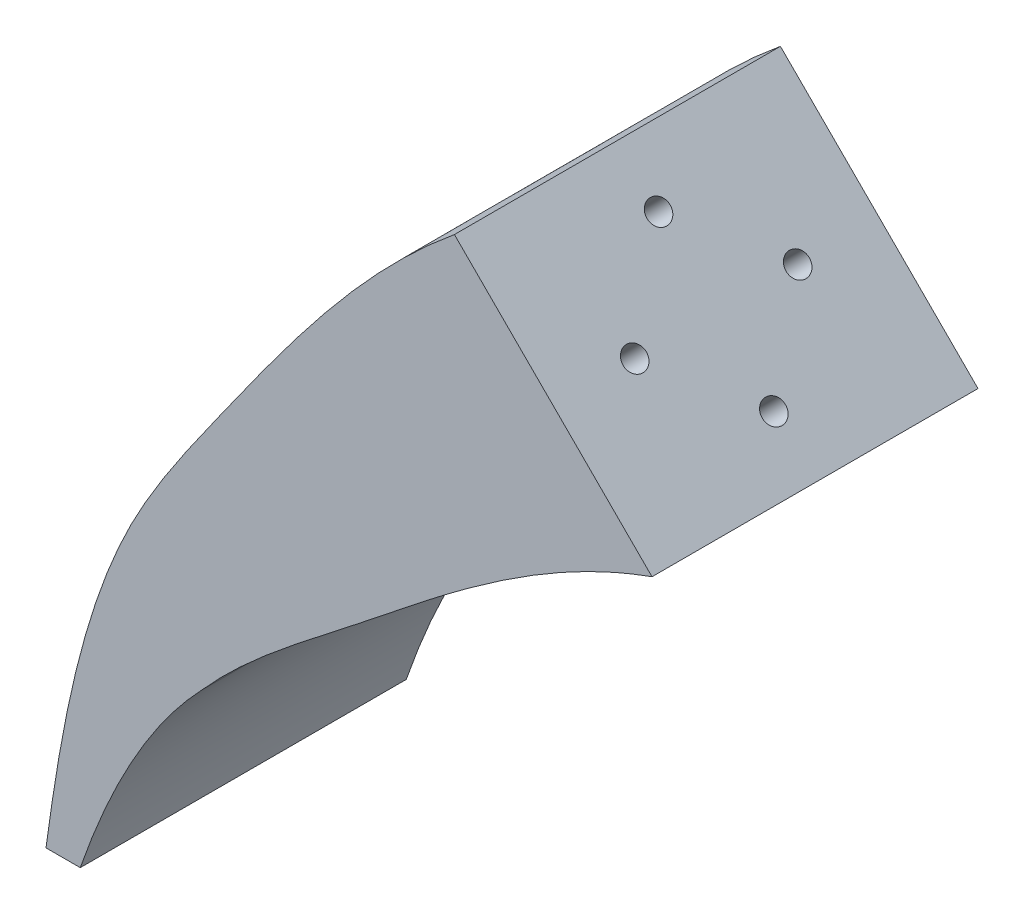
ISO-10303-21;
HEADER;
FILE_DESCRIPTION(('STEP AP214'),'2;1');
FILE_NAME('part.step','',(''),(''),'','','');
FILE_SCHEMA(('AUTOMOTIVE_DESIGN { 1 0 10303 214 1 1 1 1 }'));
ENDSEC;
DATA;
#1=APPLICATION_CONTEXT('core data for automotive mechanical design processes');
#2=APPLICATION_PROTOCOL_DEFINITION('international standard','automotive_design',2000,#1);
#3=PRODUCT_CONTEXT('',#1,'mechanical');
#4=PRODUCT('Part','Part','',(#3));
#5=PRODUCT_RELATED_PRODUCT_CATEGORY('part','',(#4));
#6=PRODUCT_DEFINITION_FORMATION('','',#4);
#7=PRODUCT_DEFINITION_CONTEXT('part definition',#1,'design');
#8=PRODUCT_DEFINITION('design','',#6,#7);
#9=PRODUCT_DEFINITION_SHAPE('','',#8);
#10=(LENGTH_UNIT() NAMED_UNIT(*) SI_UNIT(.MILLI.,.METRE.));
#11=(NAMED_UNIT(*) PLANE_ANGLE_UNIT() SI_UNIT($,.RADIAN.));
#12=(NAMED_UNIT(*) SI_UNIT($,.STERADIAN.) SOLID_ANGLE_UNIT());
#13=UNCERTAINTY_MEASURE_WITH_UNIT(LENGTH_MEASURE(1.E-05),#10,'distance_accuracy_value','');
#14=(GEOMETRIC_REPRESENTATION_CONTEXT(3) GLOBAL_UNCERTAINTY_ASSIGNED_CONTEXT((#13)) GLOBAL_UNIT_ASSIGNED_CONTEXT((#10,
#11,#12)) REPRESENTATION_CONTEXT('',''));
#15=CARTESIAN_POINT('',(0.,0.,0.));
#16=DIRECTION('',(0.,0.,1.));
#17=DIRECTION('',(1.,0.,0.));
#18=AXIS2_PLACEMENT_3D('',#15,#16,#17);
#19=CARTESIAN_POINT('',(2.0914275759303,20.6618620863459,28.));
#20=CARTESIAN_POINT('',(-6.15366528198609,13.9027780772739,28.));
#21=CARTESIAN_POINT('',(-14.8844928634813,1.61368244333864,28.));
#22=CARTESIAN_POINT('',(-29.2039351509306,-18.642558282163,28.));
#23=CARTESIAN_POINT('',(-31.7282489705518,-33.2087317797855,28.));
#24=CARTESIAN_POINT('',(-32.9878737184419,-42.5021430370833,28.));
#25=B_SPLINE_CURVE_WITH_KNOTS('',3,(#19,#20,#21,#22,#23,#24),.UNSPECIFIED.,.F.,.F.,(4,1,1,4),
(0.,0.426775149028711,0.611805153451685,1.),.UNSPECIFIED.);
#26=DIRECTION('',(0.,0.,-1.));
#27=VECTOR('',#26,1.);
#28=SURFACE_OF_LINEAR_EXTRUSION('',#25,#27);
#29=CARTESIAN_POINT('',(2.0914275759303,20.6618620863459,0.));
#30=CARTESIAN_POINT('',(-6.15366528198609,13.9027780772739,0.));
#31=CARTESIAN_POINT('',(-14.8844928634813,1.61368244333864,0.));
#32=CARTESIAN_POINT('',(-29.2039351509306,-18.642558282163,0.));
#33=CARTESIAN_POINT('',(-31.7282489705518,-33.2087317797855,0.));
#34=CARTESIAN_POINT('',(-32.9878737184419,-42.5021430370833,0.));
#35=B_SPLINE_CURVE_WITH_KNOTS('',3,(#29,#30,#31,#32,#33,#34),.UNSPECIFIED.,.F.,.F.,(4,1,1,4),
(0.,0.426775149028711,0.611805153451685,1.),.UNSPECIFIED.);
#36=CARTESIAN_POINT('',(2.0914275759303,20.6618620863459,0.));
#37=VERTEX_POINT('',#36);
#38=CARTESIAN_POINT('',(-32.9878737184419,-42.5021430370833,0.));
#39=VERTEX_POINT('',#38);
#40=EDGE_CURVE('E136',#37,#39,#35,.T.);
#41=ORIENTED_EDGE('',*,*,#40,.T.);
#42=DIRECTION('',(0.,0.,-1.));
#43=VECTOR('',#42,1.);
#44=CARTESIAN_POINT('',(-32.9878737184419,-42.5021430370833,28.));
#45=LINE('',#44,#43);
#46=CARTESIAN_POINT('',(-32.9878737184419,-42.5021430370833,28.));
#47=VERTEX_POINT('',#46);
#48=EDGE_CURVE('E11',#47,#39,#45,.T.);
#49=ORIENTED_EDGE('',*,*,#48,.F.);
#50=CARTESIAN_POINT('',(2.0914275759303,20.6618620863459,28.));
#51=VERTEX_POINT('',#50);
#52=EDGE_CURVE('E153',#51,#47,#25,.T.);
#53=ORIENTED_EDGE('',*,*,#52,.F.);
#54=DIRECTION('',(0.,0.,-1.));
#55=VECTOR('',#54,1.);
#56=CARTESIAN_POINT('',(2.0914275759303,20.6618620863459,28.));
#57=LINE('',#56,#55);
#58=EDGE_CURVE('E105',#51,#37,#57,.T.);
#59=ORIENTED_EDGE('',*,*,#58,.T.);
#60=EDGE_LOOP('',(#41,#49,#53,#59));
#61=FACE_BOUND('',#60,.T.);
#62=ADVANCED_FACE('F34',(#61),#28,.F.);
#63=CARTESIAN_POINT('',(-32.9878737184419,-42.5021430370833,28.));
#64=DIRECTION('',(0.,1.,0.));
#65=DIRECTION('',(0.,0.,1.));
#66=AXIS2_PLACEMENT_3D('',#63,#64,#65);
#67=PLANE('',#66);
#68=DIRECTION('',(1.,0.,0.));
#69=VECTOR('',#68,1.);
#70=CARTESIAN_POINT('',(-32.9878737184419,-42.5021430370833,0.));
#71=LINE('',#70,#69);
#72=CARTESIAN_POINT('',(-30.0455023165282,-42.5021430370833,0.));
#73=VERTEX_POINT('',#72);
#74=EDGE_CURVE('E131',#39,#73,#71,.T.);
#75=ORIENTED_EDGE('',*,*,#74,.T.);
#76=DIRECTION('',(0.,0.,-1.));
#77=VECTOR('',#76,1.);
#78=CARTESIAN_POINT('',(-30.0455023165282,-42.5021430370833,28.));
#79=LINE('',#78,#77);
#80=CARTESIAN_POINT('',(-30.0455023165282,-42.5021430370833,28.));
#81=VERTEX_POINT('',#80);
#82=EDGE_CURVE('E43',#81,#73,#79,.T.);
#83=ORIENTED_EDGE('',*,*,#82,.F.);
#84=DIRECTION('',(1.,0.,0.));
#85=VECTOR('',#84,1.);
#86=CARTESIAN_POINT('',(-32.9878737184419,-42.5021430370833,28.));
#87=LINE('',#86,#85);
#88=EDGE_CURVE('E85',#47,#81,#87,.T.);
#89=ORIENTED_EDGE('',*,*,#88,.F.);
#90=ORIENTED_EDGE('',*,*,#48,.T.);
#91=EDGE_LOOP('',(#75,#83,#89,#90));
#92=FACE_BOUND('',#91,.T.);
#93=ADVANCED_FACE('F125',(#92),#67,.F.);
#94=CARTESIAN_POINT('',(-30.0455023165282,-42.5021430370833,28.));
#95=CARTESIAN_POINT('',(-25.9695620975262,-30.7372945661809,28.));
#96=CARTESIAN_POINT('',(-19.6348790899217,-24.0984832836304,28.));
#97=B_SPLINE_CURVE_WITH_KNOTS('',2,(#94,#95,#96),.UNSPECIFIED.,.F.,.F.,(3,3),(0.,1.),.UNSPECIFIED.);
#98=DIRECTION('',(0.,0.,-1.));
#99=VECTOR('',#98,1.);
#100=SURFACE_OF_LINEAR_EXTRUSION('',#97,#99);
#101=CARTESIAN_POINT('',(-30.0455023165282,-42.5021430370833,0.));
#102=CARTESIAN_POINT('',(-25.9695620975262,-30.7372945661809,0.));
#103=CARTESIAN_POINT('',(-19.6348790899217,-24.0984832836304,0.));
#104=B_SPLINE_CURVE_WITH_KNOTS('',2,(#101,#102,#103),.UNSPECIFIED.,.F.,.F.,(3,3),(0.,1.),.UNSPECIFIED.);
#105=CARTESIAN_POINT('',(-19.6348790899217,-24.0984832836304,0.));
#106=VERTEX_POINT('',#105);
#107=EDGE_CURVE('E100',#73,#106,#104,.T.);
#108=ORIENTED_EDGE('',*,*,#107,.T.);
#109=DIRECTION('',(0.,0.,-1.));
#110=VECTOR('',#109,1.);
#111=CARTESIAN_POINT('',(-19.6348790899217,-24.0984832836304,28.));
#112=LINE('',#111,#110);
#113=CARTESIAN_POINT('',(-19.6348790899217,-24.0984832836304,28.));
#114=VERTEX_POINT('',#113);
#115=EDGE_CURVE('E97',#114,#106,#112,.T.);
#116=ORIENTED_EDGE('',*,*,#115,.F.);
#117=EDGE_CURVE('E89',#81,#114,#97,.T.);
#118=ORIENTED_EDGE('',*,*,#117,.F.);
#119=ORIENTED_EDGE('',*,*,#82,.T.);
#120=EDGE_LOOP('',(#108,#116,#118,#119));
#121=FACE_BOUND('',#120,.T.);
#122=ADVANCED_FACE('F98',(#121),#100,.F.);
#123=CARTESIAN_POINT('',(-19.6348790899217,-24.0984832836304,28.));
#124=CARTESIAN_POINT('',(-15.7102505841867,-19.650895956862,28.));
#125=CARTESIAN_POINT('',(-8.76852159598009,-14.5784334114889,28.));
#126=CARTESIAN_POINT('',(3.60671816571607,-4.50288138401845,28.));
#127=CARTESIAN_POINT('',(12.0226487316539,1.18137436334112,28.));
#128=CARTESIAN_POINT('',(19.0619903244077,3.69129933786898,28.));
#129=B_SPLINE_CURVE_WITH_KNOTS('',3,(#123,#124,#125,#126,#127,#128),.UNSPECIFIED.,.F.,.F.,(4,1,
1,4),(0.,0.368699222009499,0.536895808865272,1.),.UNSPECIFIED.);
#130=DIRECTION('',(0.,0.,-1.));
#131=VECTOR('',#130,1.);
#132=SURFACE_OF_LINEAR_EXTRUSION('',#129,#131);
#133=CARTESIAN_POINT('',(-19.6348790899217,-24.0984832836304,0.));
#134=CARTESIAN_POINT('',(-15.7102505841867,-19.650895956862,0.));
#135=CARTESIAN_POINT('',(-8.76852159598009,-14.5784334114889,0.));
#136=CARTESIAN_POINT('',(3.60671816571607,-4.50288138401845,0.));
#137=CARTESIAN_POINT('',(12.0226487316539,1.18137436334112,0.));
#138=CARTESIAN_POINT('',(19.0619903244077,3.69129933786898,0.));
#139=B_SPLINE_CURVE_WITH_KNOTS('',3,(#133,#134,#135,#136,#137,#138),.UNSPECIFIED.,.F.,.F.,(4,1,
1,4),(0.,0.368699222009499,0.536895808865272,1.),.UNSPECIFIED.);
#140=CARTESIAN_POINT('',(19.0619903244077,3.69129933786898,0.));
#141=VERTEX_POINT('',#140);
#142=EDGE_CURVE('E71',#106,#141,#139,.T.);
#143=ORIENTED_EDGE('',*,*,#142,.T.);
#144=DIRECTION('',(0.,0.,-1.));
#145=VECTOR('',#144,1.);
#146=CARTESIAN_POINT('',(19.0619903244077,3.69129933786898,28.));
#147=LINE('',#146,#145);
#148=CARTESIAN_POINT('',(19.0619903244077,3.69129933786898,28.));
#149=VERTEX_POINT('',#148);
#150=EDGE_CURVE('E101',#149,#141,#147,.T.);
#151=ORIENTED_EDGE('',*,*,#150,.F.);
#152=EDGE_CURVE('E93',#114,#149,#129,.T.);
#153=ORIENTED_EDGE('',*,*,#152,.F.);
#154=ORIENTED_EDGE('',*,*,#115,.T.);
#155=EDGE_LOOP('',(#143,#151,#153,#154));
#156=FACE_BOUND('',#155,.T.);
#157=ADVANCED_FACE('F103',(#156),#132,.F.);
#158=CARTESIAN_POINT('',(2.0914275759303,20.6618620863459,28.));
#159=DIRECTION('',(-0.707106781186539,-0.707106781186556,0.));
#160=DIRECTION('',(0.707106781186556,-0.707106781186539,0.));
#161=AXIS2_PLACEMENT_3D('',#158,#159,#160);
#162=PLANE('',#161);
#163=CARTESIAN_POINT('',(10.576708950169,12.1765807121074,7.));
#164=DIRECTION('',(0.707106781186539,0.707106781186556,0.));
#165=DIRECTION('',(-0.707106781186556,0.707106781186539,0.));
#166=AXIS2_PLACEMENT_3D('',#163,#164,#165);
#167=CIRCLE('',#166,0.999999999999999);
#168=CARTESIAN_POINT('',(9.86960216898242,12.883687493294,7.));
#169=VERTEX_POINT('',#168);
#170=EDGE_CURVE('E157',#169,#169,#167,.T.);
#171=ORIENTED_EDGE('',*,*,#170,.F.);
#172=EDGE_LOOP('',(#171));
#173=FACE_BOUND('',#172,.T.);
#174=CARTESIAN_POINT('',(5.62696148186308,17.1263281804132,14.));
#175=DIRECTION('',(0.707106781186539,0.707106781186556,0.));
#176=DIRECTION('',(0.707106781186556,-0.707106781186539,0.));
#177=AXIS2_PLACEMENT_3D('',#174,#175,#176);
#178=CIRCLE('',#177,1.);
#179=CARTESIAN_POINT('',(6.33406826304964,16.4192213992267,14.));
#180=VERTEX_POINT('',#179);
#181=EDGE_CURVE('E174',#180,#180,#178,.T.);
#182=ORIENTED_EDGE('',*,*,#181,.F.);
#183=EDGE_LOOP('',(#182));
#184=FACE_BOUND('',#183,.T.);
#185=CARTESIAN_POINT('',(15.5264564184749,7.22683324380167,14.));
#186=DIRECTION('',(0.707106781186539,0.707106781186556,0.));
#187=DIRECTION('',(-0.707106781186556,0.707106781186539,0.));
#188=AXIS2_PLACEMENT_3D('',#185,#186,#187);
#189=CIRCLE('',#188,1.);
#190=CARTESIAN_POINT('',(14.8193496372883,7.93394002498821,14.));
#191=VERTEX_POINT('',#190);
#192=EDGE_CURVE('E173',#191,#191,#189,.T.);
#193=ORIENTED_EDGE('',*,*,#192,.F.);
#194=EDGE_LOOP('',(#193));
#195=FACE_BOUND('',#194,.T.);
#196=CARTESIAN_POINT('',(10.576708950169,12.1765807121074,21.));
#197=DIRECTION('',(0.707106781186539,0.707106781186556,0.));
#198=DIRECTION('',(0.707106781186556,-0.707106781186539,0.));
#199=AXIS2_PLACEMENT_3D('',#196,#197,#198);
#200=CIRCLE('',#199,1.);
#201=CARTESIAN_POINT('',(11.2838157313555,11.4694739309209,21.));
#202=VERTEX_POINT('',#201);
#203=EDGE_CURVE('E179',#202,#202,#200,.T.);
#204=ORIENTED_EDGE('',*,*,#203,.F.);
#205=EDGE_LOOP('',(#204));
#206=FACE_BOUND('',#205,.T.);
#207=DIRECTION('',(-0.707106781186556,0.707106781186539,0.));
#208=VECTOR('',#207,1.);
#209=CARTESIAN_POINT('',(2.0914275759303,20.6618620863459,0.));
#210=LINE('',#209,#208);
#211=EDGE_CURVE('E77',#141,#37,#210,.T.);
#212=ORIENTED_EDGE('',*,*,#211,.T.);
#213=ORIENTED_EDGE('',*,*,#58,.F.);
#214=DIRECTION('',(-0.707106781186556,0.707106781186539,0.));
#215=VECTOR('',#214,1.);
#216=CARTESIAN_POINT('',(2.0914275759303,20.6618620863459,28.));
#217=LINE('',#216,#215);
#218=EDGE_CURVE('E51',#149,#51,#217,.T.);
#219=ORIENTED_EDGE('',*,*,#218,.F.);
#220=ORIENTED_EDGE('',*,*,#150,.T.);
#221=EDGE_LOOP('',(#212,#213,#219,#220));
#222=FACE_BOUND('',#221,.T.);
#223=ADVANCED_FACE('F122',(#173,#184,#195,#206,#222),#162,.F.);
#224=CARTESIAN_POINT('',(-21.4556629048447,-7.75412162721014,28.));
#225=DIRECTION('',(0.,0.,-1.));
#226=DIRECTION('',(-1.,0.,0.));
#227=AXIS2_PLACEMENT_3D('',#224,#225,#226);
#228=PLANE('',#227);
#229=ORIENTED_EDGE('',*,*,#52,.T.);
#230=ORIENTED_EDGE('',*,*,#88,.T.);
#231=ORIENTED_EDGE('',*,*,#117,.T.);
#232=ORIENTED_EDGE('',*,*,#152,.T.);
#233=ORIENTED_EDGE('',*,*,#218,.T.);
#234=EDGE_LOOP('',(#229,#230,#231,#232,#233));
#235=FACE_BOUND('',#234,.T.);
#236=ADVANCED_FACE('F91',(#235),#228,.F.);
#237=CARTESIAN_POINT('',(-21.4556629048447,-7.75412162721014,0.));
#238=DIRECTION('',(0.,0.,-1.));
#239=DIRECTION('',(-1.,0.,0.));
#240=AXIS2_PLACEMENT_3D('',#237,#238,#239);
#241=PLANE('',#240);
#242=ORIENTED_EDGE('',*,*,#40,.F.);
#243=ORIENTED_EDGE('',*,*,#211,.F.);
#244=ORIENTED_EDGE('',*,*,#142,.F.);
#245=ORIENTED_EDGE('',*,*,#107,.F.);
#246=ORIENTED_EDGE('',*,*,#74,.F.);
#247=EDGE_LOOP('',(#242,#243,#244,#245,#246));
#248=FACE_BOUND('',#247,.T.);
#249=ADVANCED_FACE('F138',(#248),#241,.T.);
#250=CARTESIAN_POINT('',(4.91985470067666,6.519726462615,21.));
#251=DIRECTION('',(0.707106781186539,0.707106781186556,0.));
#252=DIRECTION('',(-0.707106781186556,0.707106781186539,0.));
#253=AXIS2_PLACEMENT_3D('',#250,#251,#252);
#254=CYLINDRICAL_SURFACE('',#253,1.);
#255=CARTESIAN_POINT('',(4.91985470067666,6.519726462615,21.));
#256=DIRECTION('',(0.707106781186539,0.707106781186556,0.));
#257=DIRECTION('',(0.707106781186556,-0.707106781186539,0.));
#258=AXIS2_PLACEMENT_3D('',#255,#256,#257);
#259=CIRCLE('',#258,1.);
#260=CARTESIAN_POINT('',(5.62696148186322,5.81261968142846,21.));
#261=VERTEX_POINT('',#260);
#262=EDGE_CURVE('E167',#261,#261,#259,.T.);
#263=ORIENTED_EDGE('',*,*,#262,.F.);
#264=EDGE_LOOP('',(#263));
#265=FACE_BOUND('',#264,.T.);
#266=ORIENTED_EDGE('',*,*,#203,.T.);
#267=EDGE_LOOP('',(#266));
#268=FACE_BOUND('',#267,.T.);
#269=ADVANCED_FACE('F202',(#265,#268),#254,.F.);
#270=CARTESIAN_POINT('',(4.91985470067666,6.519726462615,21.));
#271=DIRECTION('',(-0.707106781186539,-0.707106781186556,0.));
#272=DIRECTION('',(0.707106781186556,-0.707106781186539,0.));
#273=AXIS2_PLACEMENT_3D('',#270,#271,#272);
#274=PLANE('',#273);
#275=ORIENTED_EDGE('',*,*,#262,.T.);
#276=EDGE_LOOP('',(#275));
#277=FACE_BOUND('',#276,.T.);
#278=ADVANCED_FACE('F204',(#277),#274,.F.);
#279=CARTESIAN_POINT('',(9.86960216898256,1.56997899430922,14.));
#280=DIRECTION('',(0.707106781186539,0.707106781186556,0.));
#281=DIRECTION('',(-0.707106781186556,0.707106781186539,0.));
#282=AXIS2_PLACEMENT_3D('',#279,#280,#281);
#283=CYLINDRICAL_SURFACE('',#282,1.);
#284=CARTESIAN_POINT('',(9.86960216898256,1.56997899430922,14.));
#285=DIRECTION('',(0.707106781186539,0.707106781186556,0.));
#286=DIRECTION('',(-0.707106781186556,0.707106781186539,0.));
#287=AXIS2_PLACEMENT_3D('',#284,#285,#286);
#288=CIRCLE('',#287,1.);
#289=CARTESIAN_POINT('',(9.162495387796,2.27708577549576,14.));
#290=VERTEX_POINT('',#289);
#291=EDGE_CURVE('E182',#290,#290,#288,.T.);
#292=ORIENTED_EDGE('',*,*,#291,.F.);
#293=EDGE_LOOP('',(#292));
#294=FACE_BOUND('',#293,.T.);
#295=ORIENTED_EDGE('',*,*,#192,.T.);
#296=EDGE_LOOP('',(#295));
#297=FACE_BOUND('',#296,.T.);
#298=ADVANCED_FACE('F195',(#294,#297),#283,.F.);
#299=CARTESIAN_POINT('',(9.86960216898256,1.56997899430922,14.));
#300=DIRECTION('',(0.707106781186539,0.707106781186556,0.));
#301=DIRECTION('',(-0.707106781186556,0.707106781186539,0.));
#302=AXIS2_PLACEMENT_3D('',#299,#300,#301);
#303=PLANE('',#302);
#304=ORIENTED_EDGE('',*,*,#291,.T.);
#305=EDGE_LOOP('',(#304));
#306=FACE_BOUND('',#305,.T.);
#307=ADVANCED_FACE('F216',(#306),#303,.T.);
#308=CARTESIAN_POINT('',(-0.0298927676292311,11.4694739309208,14.));
#309=DIRECTION('',(0.707106781186539,0.707106781186556,0.));
#310=DIRECTION('',(-0.707106781186556,0.707106781186539,0.));
#311=AXIS2_PLACEMENT_3D('',#308,#309,#310);
#312=CYLINDRICAL_SURFACE('',#311,1.);
#313=CARTESIAN_POINT('',(-0.0298927676292311,11.4694739309208,14.));
#314=DIRECTION('',(0.707106781186539,0.707106781186556,0.));
#315=DIRECTION('',(0.707106781186556,-0.707106781186539,0.));
#316=AXIS2_PLACEMENT_3D('',#313,#314,#315);
#317=CIRCLE('',#316,1.);
#318=CARTESIAN_POINT('',(0.677214013557325,10.7623671497342,14.));
#319=VERTEX_POINT('',#318);
#320=EDGE_CURVE('E170',#319,#319,#317,.T.);
#321=ORIENTED_EDGE('',*,*,#320,.F.);
#322=EDGE_LOOP('',(#321));
#323=FACE_BOUND('',#322,.T.);
#324=ORIENTED_EDGE('',*,*,#181,.T.);
#325=EDGE_LOOP('',(#324));
#326=FACE_BOUND('',#325,.T.);
#327=ADVANCED_FACE('F219',(#323,#326),#312,.F.);
#328=CARTESIAN_POINT('',(-0.0298927676292311,11.4694739309208,14.));
#329=DIRECTION('',(-0.707106781186539,-0.707106781186556,0.));
#330=DIRECTION('',(0.707106781186556,-0.707106781186539,0.));
#331=AXIS2_PLACEMENT_3D('',#328,#329,#330);
#332=PLANE('',#331);
#333=ORIENTED_EDGE('',*,*,#320,.T.);
#334=EDGE_LOOP('',(#333));
#335=FACE_BOUND('',#334,.T.);
#336=ADVANCED_FACE('F270',(#335),#332,.F.);
#337=CARTESIAN_POINT('',(4.91985470067666,6.519726462615,7.));
#338=DIRECTION('',(0.707106781186539,0.707106781186556,0.));
#339=DIRECTION('',(-0.707106781186556,0.707106781186539,0.));
#340=AXIS2_PLACEMENT_3D('',#337,#338,#339);
#341=CYLINDRICAL_SURFACE('',#340,0.999999999999999);
#342=CARTESIAN_POINT('',(4.91985470067666,6.519726462615,7.));
#343=DIRECTION('',(0.707106781186539,0.707106781186556,0.));
#344=DIRECTION('',(-0.707106781186556,0.707106781186539,0.));
#345=AXIS2_PLACEMENT_3D('',#342,#343,#344);
#346=CIRCLE('',#345,0.999999999999999);
#347=CARTESIAN_POINT('',(4.21274791949011,7.22683324380154,7.));
#348=VERTEX_POINT('',#347);
#349=EDGE_CURVE('E155',#348,#348,#346,.T.);
#350=ORIENTED_EDGE('',*,*,#349,.F.);
#351=EDGE_LOOP('',(#350));
#352=FACE_BOUND('',#351,.T.);
#353=ORIENTED_EDGE('',*,*,#170,.T.);
#354=EDGE_LOOP('',(#353));
#355=FACE_BOUND('',#354,.T.);
#356=ADVANCED_FACE('F279',(#352,#355),#341,.F.);
#357=CARTESIAN_POINT('',(4.91985470067666,6.519726462615,7.));
#358=DIRECTION('',(0.707106781186539,0.707106781186556,0.));
#359=DIRECTION('',(-0.707106781186556,0.707106781186539,0.));
#360=AXIS2_PLACEMENT_3D('',#357,#358,#359);
#361=PLANE('',#360);
#362=ORIENTED_EDGE('',*,*,#349,.T.);
#363=EDGE_LOOP('',(#362));
#364=FACE_BOUND('',#363,.T.);
#365=ADVANCED_FACE('F289',(#364),#361,.T.);
#366=CLOSED_SHELL('',(#62,#93,#122,#157,#223,#236,#249,#269,#278,#298,#307,#327,#336,#356,#365));
#367=MANIFOLD_SOLID_BREP('B2',#366);
#368=ADVANCED_BREP_SHAPE_REPRESENTATION('',(#18,#367),#14);
#369=SHAPE_DEFINITION_REPRESENTATION(#9,#368);
ENDSEC;
END-ISO-10303-21;
